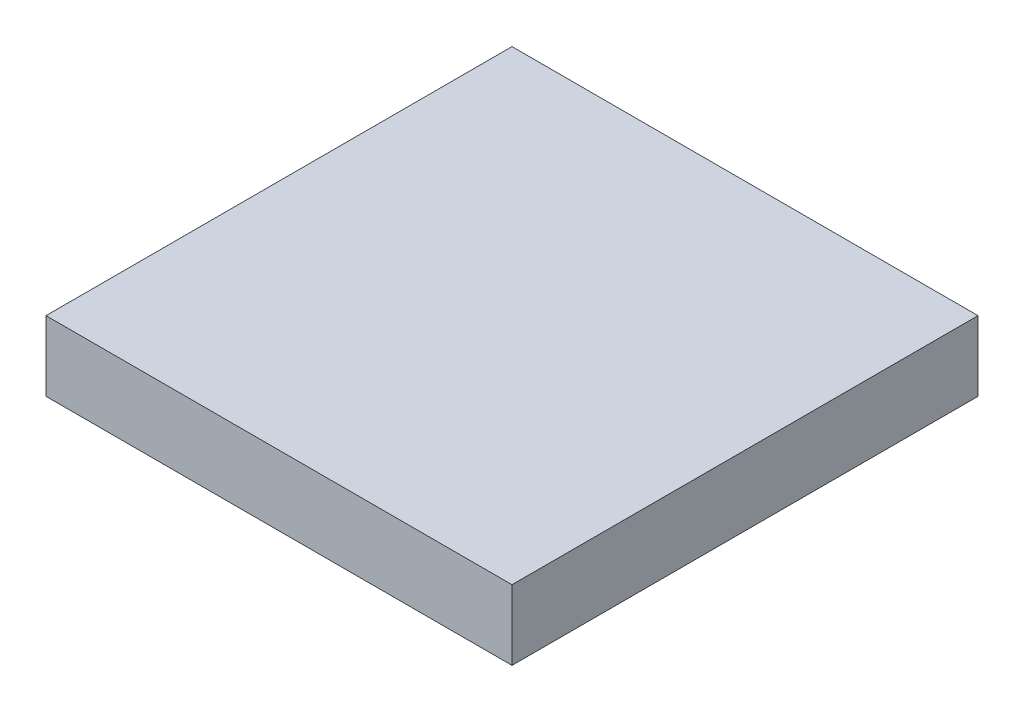
ISO-10303-21;
HEADER;
FILE_DESCRIPTION(('STEP AP214'),'2;1');
FILE_NAME('part.step','',(''),(''),'','','');
FILE_SCHEMA(('AUTOMOTIVE_DESIGN { 1 0 10303 214 1 1 1 1 }'));
ENDSEC;
DATA;
#1=APPLICATION_CONTEXT('core data for automotive mechanical design processes');
#2=APPLICATION_PROTOCOL_DEFINITION('international standard','automotive_design',2000,#1);
#3=PRODUCT_CONTEXT('',#1,'mechanical');
#4=PRODUCT('Part','Part','',(#3));
#5=PRODUCT_RELATED_PRODUCT_CATEGORY('part','',(#4));
#6=PRODUCT_DEFINITION_FORMATION('','',#4);
#7=PRODUCT_DEFINITION_CONTEXT('part definition',#1,'design');
#8=PRODUCT_DEFINITION('design','',#6,#7);
#9=PRODUCT_DEFINITION_SHAPE('','',#8);
#10=(LENGTH_UNIT() NAMED_UNIT(*) SI_UNIT(.MILLI.,.METRE.));
#11=(NAMED_UNIT(*) PLANE_ANGLE_UNIT() SI_UNIT($,.RADIAN.));
#12=(NAMED_UNIT(*) SI_UNIT($,.STERADIAN.) SOLID_ANGLE_UNIT());
#13=UNCERTAINTY_MEASURE_WITH_UNIT(LENGTH_MEASURE(1.E-05),#10,'distance_accuracy_value','');
#14=(GEOMETRIC_REPRESENTATION_CONTEXT(3) GLOBAL_UNCERTAINTY_ASSIGNED_CONTEXT((#13)) GLOBAL_UNIT_ASSIGNED_CONTEXT((#10,
#11,#12)) REPRESENTATION_CONTEXT('',''));
#15=CARTESIAN_POINT('',(0.,0.,0.));
#16=DIRECTION('',(0.,0.,1.));
#17=DIRECTION('',(1.,0.,0.));
#18=AXIS2_PLACEMENT_3D('',#15,#16,#17);
#19=CARTESIAN_POINT('',(-35.7160409556314,15.24,27.5672354948806));
#20=DIRECTION('',(1.,0.,0.));
#21=DIRECTION('',(0.,0.,-1.));
#22=AXIS2_PLACEMENT_3D('',#19,#20,#21);
#23=PLANE('',#22);
#24=DIRECTION('',(0.,0.,1.));
#25=VECTOR('',#24,1.);
#26=CARTESIAN_POINT('',(-35.7160409556314,0.,27.5672354948806));
#27=LINE('',#26,#25);
#28=CARTESIAN_POINT('',(-35.7160409556314,0.,-74.0327645051194));
#29=VERTEX_POINT('',#28);
#30=CARTESIAN_POINT('',(-35.7160409556314,0.,27.5672354948806));
#31=VERTEX_POINT('',#30);
#32=EDGE_CURVE('E96',#29,#31,#27,.T.);
#33=ORIENTED_EDGE('',*,*,#32,.T.);
#34=DIRECTION('',(0.,-1.,0.));
#35=VECTOR('',#34,1.);
#36=CARTESIAN_POINT('',(-35.7160409556314,15.24,27.5672354948806));
#37=LINE('',#36,#35);
#38=CARTESIAN_POINT('',(-35.7160409556314,15.24,27.5672354948806));
#39=VERTEX_POINT('',#38);
#40=EDGE_CURVE('E11',#39,#31,#37,.T.);
#41=ORIENTED_EDGE('',*,*,#40,.F.);
#42=DIRECTION('',(0.,0.,1.));
#43=VECTOR('',#42,1.);
#44=CARTESIAN_POINT('',(-35.7160409556314,15.24,27.5672354948806));
#45=LINE('',#44,#43);
#46=CARTESIAN_POINT('',(-35.7160409556314,15.24,-74.0327645051194));
#47=VERTEX_POINT('',#46);
#48=EDGE_CURVE('E84',#47,#39,#45,.T.);
#49=ORIENTED_EDGE('',*,*,#48,.F.);
#50=DIRECTION('',(0.,-1.,0.));
#51=VECTOR('',#50,1.);
#52=CARTESIAN_POINT('',(-35.7160409556314,15.24,-74.0327645051194));
#53=LINE('',#52,#51);
#54=EDGE_CURVE('E92',#47,#29,#53,.T.);
#55=ORIENTED_EDGE('',*,*,#54,.T.);
#56=EDGE_LOOP('',(#33,#41,#49,#55));
#57=FACE_BOUND('',#56,.T.);
#58=ADVANCED_FACE('F33',(#57),#23,.F.);
#59=CARTESIAN_POINT('',(-35.7160409556314,15.24,27.5672354948806));
#60=DIRECTION('',(0.,0.,-1.));
#61=DIRECTION('',(-1.,0.,0.));
#62=AXIS2_PLACEMENT_3D('',#59,#60,#61);
#63=PLANE('',#62);
#64=DIRECTION('',(1.,0.,0.));
#65=VECTOR('',#64,1.);
#66=CARTESIAN_POINT('',(-35.7160409556314,0.,27.5672354948806));
#67=LINE('',#66,#65);
#68=CARTESIAN_POINT('',(65.8839590443686,0.,27.5672354948806));
#69=VERTEX_POINT('',#68);
#70=EDGE_CURVE('E88',#31,#69,#67,.T.);
#71=ORIENTED_EDGE('',*,*,#70,.T.);
#72=DIRECTION('',(0.,-1.,0.));
#73=VECTOR('',#72,1.);
#74=CARTESIAN_POINT('',(65.8839590443686,15.24,27.5672354948806));
#75=LINE('',#74,#73);
#76=CARTESIAN_POINT('',(65.8839590443686,15.24,27.5672354948806));
#77=VERTEX_POINT('',#76);
#78=EDGE_CURVE('E41',#77,#69,#75,.T.);
#79=ORIENTED_EDGE('',*,*,#78,.F.);
#80=DIRECTION('',(1.,0.,0.));
#81=VECTOR('',#80,1.);
#82=CARTESIAN_POINT('',(-35.7160409556314,15.24,27.5672354948806));
#83=LINE('',#82,#81);
#84=EDGE_CURVE('E79',#39,#77,#83,.T.);
#85=ORIENTED_EDGE('',*,*,#84,.F.);
#86=ORIENTED_EDGE('',*,*,#40,.T.);
#87=EDGE_LOOP('',(#71,#79,#85,#86));
#88=FACE_BOUND('',#87,.T.);
#89=ADVANCED_FACE('F87',(#88),#63,.F.);
#90=CARTESIAN_POINT('',(65.8839590443686,15.24,27.5672354948806));
#91=DIRECTION('',(-1.,0.,0.));
#92=DIRECTION('',(0.,0.,1.));
#93=AXIS2_PLACEMENT_3D('',#90,#91,#92);
#94=PLANE('',#93);
#95=DIRECTION('',(0.,0.,-1.));
#96=VECTOR('',#95,1.);
#97=CARTESIAN_POINT('',(65.8839590443686,0.,27.5672354948806));
#98=LINE('',#97,#96);
#99=CARTESIAN_POINT('',(65.8839590443686,0.,-74.0327645051194));
#100=VERTEX_POINT('',#99);
#101=EDGE_CURVE('E66',#69,#100,#98,.T.);
#102=ORIENTED_EDGE('',*,*,#101,.T.);
#103=DIRECTION('',(0.,-1.,0.));
#104=VECTOR('',#103,1.);
#105=CARTESIAN_POINT('',(65.8839590443686,15.24,-74.0327645051194));
#106=LINE('',#105,#104);
#107=CARTESIAN_POINT('',(65.8839590443686,15.24,-74.0327645051194));
#108=VERTEX_POINT('',#107);
#109=EDGE_CURVE('E89',#108,#100,#106,.T.);
#110=ORIENTED_EDGE('',*,*,#109,.F.);
#111=DIRECTION('',(0.,0.,-1.));
#112=VECTOR('',#111,1.);
#113=CARTESIAN_POINT('',(65.8839590443686,15.24,27.5672354948806));
#114=LINE('',#113,#112);
#115=EDGE_CURVE('E82',#77,#108,#114,.T.);
#116=ORIENTED_EDGE('',*,*,#115,.F.);
#117=ORIENTED_EDGE('',*,*,#78,.T.);
#118=EDGE_LOOP('',(#102,#110,#116,#117));
#119=FACE_BOUND('',#118,.T.);
#120=ADVANCED_FACE('F90',(#119),#94,.F.);
#121=CARTESIAN_POINT('',(-35.7160409556314,15.24,-74.0327645051194));
#122=DIRECTION('',(0.,0.,1.));
#123=DIRECTION('',(1.,0.,0.));
#124=AXIS2_PLACEMENT_3D('',#121,#122,#123);
#125=PLANE('',#124);
#126=DIRECTION('',(-1.,0.,0.));
#127=VECTOR('',#126,1.);
#128=CARTESIAN_POINT('',(-35.7160409556314,0.,-74.0327645051194));
#129=LINE('',#128,#127);
#130=EDGE_CURVE('E72',#100,#29,#129,.T.);
#131=ORIENTED_EDGE('',*,*,#130,.T.);
#132=ORIENTED_EDGE('',*,*,#54,.F.);
#133=DIRECTION('',(-1.,0.,0.));
#134=VECTOR('',#133,1.);
#135=CARTESIAN_POINT('',(-35.7160409556314,15.24,-74.0327645051194));
#136=LINE('',#135,#134);
#137=EDGE_CURVE('E49',#108,#47,#136,.T.);
#138=ORIENTED_EDGE('',*,*,#137,.F.);
#139=ORIENTED_EDGE('',*,*,#109,.T.);
#140=EDGE_LOOP('',(#131,#132,#138,#139));
#141=FACE_BOUND('',#140,.T.);
#142=ADVANCED_FACE('F104',(#141),#125,.F.);
#143=CARTESIAN_POINT('',(0.,15.24,0.));
#144=DIRECTION('',(0.,-1.,0.));
#145=DIRECTION('',(0.,0.,-1.));
#146=AXIS2_PLACEMENT_3D('',#143,#144,#145);
#147=PLANE('',#146);
#148=ORIENTED_EDGE('',*,*,#48,.T.);
#149=ORIENTED_EDGE('',*,*,#84,.T.);
#150=ORIENTED_EDGE('',*,*,#115,.T.);
#151=ORIENTED_EDGE('',*,*,#137,.T.);
#152=EDGE_LOOP('',(#148,#149,#150,#151));
#153=FACE_BOUND('',#152,.T.);
#154=ADVANCED_FACE('F80',(#153),#147,.F.);
#155=CARTESIAN_POINT('',(0.,0.,0.));
#156=DIRECTION('',(0.,-1.,0.));
#157=DIRECTION('',(0.,0.,-1.));
#158=AXIS2_PLACEMENT_3D('',#155,#156,#157);
#159=PLANE('',#158);
#160=CARTESIAN_POINT('',(15.0839590443686,0.,-23.2327645051194));
#161=DIRECTION('',(0.,-1.,0.));
#162=DIRECTION('',(0.,0.,-1.));
#163=AXIS2_PLACEMENT_3D('',#160,#161,#162);
#164=CIRCLE('',#163,2.413);
#165=CARTESIAN_POINT('',(15.0839590443686,0.,-25.6457645051194));
#166=VERTEX_POINT('',#165);
#167=EDGE_CURVE('E110',#166,#166,#164,.T.);
#168=ORIENTED_EDGE('',*,*,#167,.F.);
#169=EDGE_LOOP('',(#168));
#170=FACE_BOUND('',#169,.T.);
#171=ORIENTED_EDGE('',*,*,#32,.F.);
#172=ORIENTED_EDGE('',*,*,#130,.F.);
#173=ORIENTED_EDGE('',*,*,#101,.F.);
#174=ORIENTED_EDGE('',*,*,#70,.F.);
#175=EDGE_LOOP('',(#171,#172,#173,#174));
#176=FACE_BOUND('',#175,.T.);
#177=ADVANCED_FACE('F107',(#170,#176),#159,.T.);
#178=CARTESIAN_POINT('',(15.0839590443686,10.16,-23.2327645051194));
#179=DIRECTION('',(0.,-1.,0.));
#180=DIRECTION('',(0.,0.,-1.));
#181=AXIS2_PLACEMENT_3D('',#178,#179,#180);
#182=CYLINDRICAL_SURFACE('',#181,2.413);
#183=CARTESIAN_POINT('',(15.0839590443686,10.16,-23.2327645051194));
#184=DIRECTION('',(0.,-1.,0.));
#185=DIRECTION('',(0.,0.,-1.));
#186=AXIS2_PLACEMENT_3D('',#183,#184,#185);
#187=CIRCLE('',#186,2.413);
#188=CARTESIAN_POINT('',(15.0839590443686,10.16,-25.6457645051194));
#189=VERTEX_POINT('',#188);
#190=EDGE_CURVE('E99',#189,#189,#187,.T.);
#191=ORIENTED_EDGE('',*,*,#190,.F.);
#192=EDGE_LOOP('',(#191));
#193=FACE_BOUND('',#192,.T.);
#194=ORIENTED_EDGE('',*,*,#167,.T.);
#195=EDGE_LOOP('',(#194));
#196=FACE_BOUND('',#195,.T.);
#197=ADVANCED_FACE('F118',(#193,#196),#182,.F.);
#198=CARTESIAN_POINT('',(15.0839590443686,10.16,-23.2327645051194));
#199=DIRECTION('',(0.,-1.,0.));
#200=DIRECTION('',(0.,0.,-1.));
#201=AXIS2_PLACEMENT_3D('',#198,#199,#200);
#202=PLANE('',#201);
#203=ORIENTED_EDGE('',*,*,#190,.T.);
#204=EDGE_LOOP('',(#203));
#205=FACE_BOUND('',#204,.T.);
#206=ADVANCED_FACE('F116',(#205),#202,.T.);
#207=CLOSED_SHELL('',(#58,#89,#120,#142,#154,#177,#197,#206));
#208=MANIFOLD_SOLID_BREP('B2',#207);
#209=ADVANCED_BREP_SHAPE_REPRESENTATION('',(#18,#208),#14);
#210=SHAPE_DEFINITION_REPRESENTATION(#9,#209);
ENDSEC;
END-ISO-10303-21;
